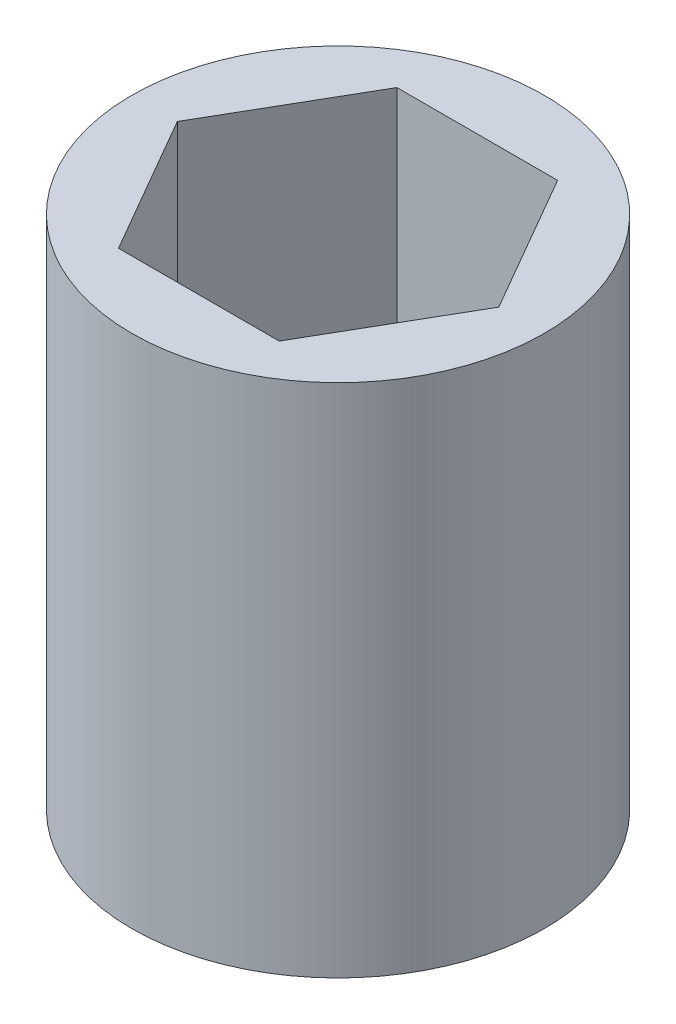
ISO-10303-21;
HEADER;
FILE_DESCRIPTION(('STEP AP214'),'2;1');
FILE_NAME('part.step','',(''),(''),'','','');
FILE_SCHEMA(('AUTOMOTIVE_DESIGN { 1 0 10303 214 1 1 1 1 }'));
ENDSEC;
DATA;
#1=APPLICATION_CONTEXT('core data for automotive mechanical design processes');
#2=APPLICATION_PROTOCOL_DEFINITION('international standard','automotive_design',2000,#1);
#3=PRODUCT_CONTEXT('',#1,'mechanical');
#4=PRODUCT('Part','Part','',(#3));
#5=PRODUCT_RELATED_PRODUCT_CATEGORY('part','',(#4));
#6=PRODUCT_DEFINITION_FORMATION('','',#4);
#7=PRODUCT_DEFINITION_CONTEXT('part definition',#1,'design');
#8=PRODUCT_DEFINITION('design','',#6,#7);
#9=PRODUCT_DEFINITION_SHAPE('','',#8);
#10=(LENGTH_UNIT() NAMED_UNIT(*) SI_UNIT(.MILLI.,.METRE.));
#11=(NAMED_UNIT(*) PLANE_ANGLE_UNIT() SI_UNIT($,.RADIAN.));
#12=(NAMED_UNIT(*) SI_UNIT($,.STERADIAN.) SOLID_ANGLE_UNIT());
#13=UNCERTAINTY_MEASURE_WITH_UNIT(LENGTH_MEASURE(1.E-05),#10,'distance_accuracy_value','');
#14=(GEOMETRIC_REPRESENTATION_CONTEXT(3) GLOBAL_UNCERTAINTY_ASSIGNED_CONTEXT((#13)) GLOBAL_UNIT_ASSIGNED_CONTEXT((#10,
#11,#12)) REPRESENTATION_CONTEXT('',''));
#15=CARTESIAN_POINT('',(0.,0.,0.));
#16=DIRECTION('',(0.,0.,1.));
#17=DIRECTION('',(1.,0.,0.));
#18=AXIS2_PLACEMENT_3D('',#15,#16,#17);
#19=CARTESIAN_POINT('',(0.,25.4,0.));
#20=DIRECTION('',(0.,1.,0.));
#21=DIRECTION('',(0.,0.,1.));
#22=AXIS2_PLACEMENT_3D('',#19,#20,#21);
#23=PLANE('',#22);
#24=CARTESIAN_POINT('',(0.,25.4,0.));
#25=DIRECTION('',(0.,1.,0.));
#26=DIRECTION('',(0.,0.,1.));
#27=AXIS2_PLACEMENT_3D('',#24,#25,#26);
#28=CIRCLE('',#27,10.16);
#29=CARTESIAN_POINT('',(0.,25.4,10.16));
#30=VERTEX_POINT('',#29);
#31=EDGE_CURVE('E11',#30,#30,#28,.T.);
#32=ORIENTED_EDGE('',*,*,#31,.T.);
#33=EDGE_LOOP('',(#32));
#34=FACE_BOUND('',#33,.T.);
#35=DIRECTION('',(-0.5,0.,-0.866025403784438));
#36=VECTOR('',#35,1.);
#37=CARTESIAN_POINT('',(7.9189362922049,25.4,0.));
#38=LINE('',#37,#36);
#39=CARTESIAN_POINT('',(7.9189362922049,25.4,0.));
#40=VERTEX_POINT('',#39);
#41=CARTESIAN_POINT('',(3.95946814610245,25.4,-6.858));
#42=VERTEX_POINT('',#41);
#43=EDGE_CURVE('E102',#40,#42,#38,.T.);
#44=ORIENTED_EDGE('',*,*,#43,.F.);
#45=DIRECTION('',(0.5,0.,-0.866025403784439));
#46=VECTOR('',#45,1.);
#47=CARTESIAN_POINT('',(3.95946814610245,25.4,6.858));
#48=LINE('',#47,#46);
#49=CARTESIAN_POINT('',(3.95946814610245,25.4,6.858));
#50=VERTEX_POINT('',#49);
#51=EDGE_CURVE('E93',#50,#40,#48,.T.);
#52=ORIENTED_EDGE('',*,*,#51,.F.);
#53=DIRECTION('',(1.,0.,0.));
#54=VECTOR('',#53,1.);
#55=CARTESIAN_POINT('',(-3.95946814610245,25.4,6.858));
#56=LINE('',#55,#54);
#57=CARTESIAN_POINT('',(-3.95946814610245,25.4,6.858));
#58=VERTEX_POINT('',#57);
#59=EDGE_CURVE('E127',#58,#50,#56,.T.);
#60=ORIENTED_EDGE('',*,*,#59,.F.);
#61=DIRECTION('',(0.5,0.,0.866025403784439));
#62=VECTOR('',#61,1.);
#63=CARTESIAN_POINT('',(-7.91893629220491,25.4,0.));
#64=LINE('',#63,#62);
#65=CARTESIAN_POINT('',(-7.91893629220491,25.4,0.));
#66=VERTEX_POINT('',#65);
#67=EDGE_CURVE('E124',#66,#58,#64,.T.);
#68=ORIENTED_EDGE('',*,*,#67,.F.);
#69=DIRECTION('',(-0.5,0.,0.866025403784439));
#70=VECTOR('',#69,1.);
#71=CARTESIAN_POINT('',(-3.95946814610245,25.4,-6.858));
#72=LINE('',#71,#70);
#73=CARTESIAN_POINT('',(-3.95946814610245,25.4,-6.858));
#74=VERTEX_POINT('',#73);
#75=EDGE_CURVE('E119',#74,#66,#72,.T.);
#76=ORIENTED_EDGE('',*,*,#75,.F.);
#77=DIRECTION('',(-1.,0.,0.));
#78=VECTOR('',#77,1.);
#79=CARTESIAN_POINT('',(3.95946814610245,25.4,-6.858));
#80=LINE('',#79,#78);
#81=EDGE_CURVE('E115',#42,#74,#80,.T.);
#82=ORIENTED_EDGE('',*,*,#81,.F.);
#83=EDGE_LOOP('',(#44,#52,#60,#68,#76,#82));
#84=FACE_BOUND('',#83,.T.);
#85=ADVANCED_FACE('F39',(#34,#84),#23,.T.);
#86=CARTESIAN_POINT('',(0.,0.,0.));
#87=DIRECTION('',(0.,1.,0.));
#88=DIRECTION('',(0.,0.,1.));
#89=AXIS2_PLACEMENT_3D('',#86,#87,#88);
#90=PLANE('',#89);
#91=CARTESIAN_POINT('',(0.,0.,0.));
#92=DIRECTION('',(0.,1.,0.));
#93=DIRECTION('',(0.,0.,1.));
#94=AXIS2_PLACEMENT_3D('',#91,#92,#93);
#95=CIRCLE('',#94,10.16);
#96=CARTESIAN_POINT('',(0.,0.,10.16));
#97=VERTEX_POINT('',#96);
#98=EDGE_CURVE('E43',#97,#97,#95,.T.);
#99=ORIENTED_EDGE('',*,*,#98,.F.);
#100=EDGE_LOOP('',(#99));
#101=FACE_BOUND('',#100,.T.);
#102=DIRECTION('',(0.5,0.,-0.866025403784439));
#103=VECTOR('',#102,1.);
#104=CARTESIAN_POINT('',(3.95946814610245,0.,6.858));
#105=LINE('',#104,#103);
#106=CARTESIAN_POINT('',(3.95946814610245,0.,6.858));
#107=VERTEX_POINT('',#106);
#108=CARTESIAN_POINT('',(7.9189362922049,0.,0.));
#109=VERTEX_POINT('',#108);
#110=EDGE_CURVE('E63',#107,#109,#105,.T.);
#111=ORIENTED_EDGE('',*,*,#110,.T.);
#112=DIRECTION('',(-0.5,0.,-0.866025403784438));
#113=VECTOR('',#112,1.);
#114=CARTESIAN_POINT('',(7.9189362922049,0.,0.));
#115=LINE('',#114,#113);
#116=CARTESIAN_POINT('',(3.95946814610245,0.,-6.858));
#117=VERTEX_POINT('',#116);
#118=EDGE_CURVE('E109',#109,#117,#115,.T.);
#119=ORIENTED_EDGE('',*,*,#118,.T.);
#120=DIRECTION('',(-1.,0.,0.));
#121=VECTOR('',#120,1.);
#122=CARTESIAN_POINT('',(3.95946814610245,0.,-6.858));
#123=LINE('',#122,#121);
#124=CARTESIAN_POINT('',(-3.95946814610245,0.,-6.858));
#125=VERTEX_POINT('',#124);
#126=EDGE_CURVE('E134',#117,#125,#123,.T.);
#127=ORIENTED_EDGE('',*,*,#126,.T.);
#128=DIRECTION('',(-0.5,0.,0.866025403784439));
#129=VECTOR('',#128,1.);
#130=CARTESIAN_POINT('',(-3.95946814610245,0.,-6.858));
#131=LINE('',#130,#129);
#132=CARTESIAN_POINT('',(-7.91893629220491,0.,0.));
#133=VERTEX_POINT('',#132);
#134=EDGE_CURVE('E138',#125,#133,#131,.T.);
#135=ORIENTED_EDGE('',*,*,#134,.T.);
#136=DIRECTION('',(0.5,0.,0.866025403784439));
#137=VECTOR('',#136,1.);
#138=CARTESIAN_POINT('',(-7.91893629220491,0.,0.));
#139=LINE('',#138,#137);
#140=CARTESIAN_POINT('',(-3.95946814610245,0.,6.858));
#141=VERTEX_POINT('',#140);
#142=EDGE_CURVE('E142',#133,#141,#139,.T.);
#143=ORIENTED_EDGE('',*,*,#142,.T.);
#144=DIRECTION('',(1.,0.,0.));
#145=VECTOR('',#144,1.);
#146=CARTESIAN_POINT('',(-3.95946814610245,0.,6.858));
#147=LINE('',#146,#145);
#148=EDGE_CURVE('E103',#141,#107,#147,.T.);
#149=ORIENTED_EDGE('',*,*,#148,.T.);
#150=EDGE_LOOP('',(#111,#119,#127,#135,#143,#149));
#151=FACE_BOUND('',#150,.T.);
#152=ADVANCED_FACE('F166',(#101,#151),#90,.F.);
#153=CARTESIAN_POINT('',(0.,25.4,0.));
#154=DIRECTION('',(0.,-1.,0.));
#155=DIRECTION('',(0.,0.,-1.));
#156=AXIS2_PLACEMENT_3D('',#153,#154,#155);
#157=CYLINDRICAL_SURFACE('',#156,10.16);
#158=ORIENTED_EDGE('',*,*,#31,.F.);
#159=EDGE_LOOP('',(#158));
#160=FACE_BOUND('',#159,.T.);
#161=ORIENTED_EDGE('',*,*,#98,.T.);
#162=EDGE_LOOP('',(#161));
#163=FACE_BOUND('',#162,.T.);
#164=ADVANCED_FACE('F41',(#160,#163),#157,.T.);
#165=CARTESIAN_POINT('',(3.95946814610245,25.4,6.858));
#166=DIRECTION('',(-0.866025403784439,0.,-0.5));
#167=DIRECTION('',(-0.5,0.,0.866025403784439));
#168=AXIS2_PLACEMENT_3D('',#165,#166,#167);
#169=PLANE('',#168);
#170=ORIENTED_EDGE('',*,*,#110,.F.);
#171=DIRECTION('',(0.,-1.,0.));
#172=VECTOR('',#171,1.);
#173=CARTESIAN_POINT('',(3.95946814610245,25.4,6.858));
#174=LINE('',#173,#172);
#175=EDGE_CURVE('E97',#50,#107,#174,.T.);
#176=ORIENTED_EDGE('',*,*,#175,.F.);
#177=ORIENTED_EDGE('',*,*,#51,.T.);
#178=DIRECTION('',(0.,-1.,0.));
#179=VECTOR('',#178,1.);
#180=CARTESIAN_POINT('',(7.9189362922049,25.4,0.));
#181=LINE('',#180,#179);
#182=EDGE_CURVE('E96',#40,#109,#181,.T.);
#183=ORIENTED_EDGE('',*,*,#182,.T.);
#184=EDGE_LOOP('',(#170,#176,#177,#183));
#185=FACE_BOUND('',#184,.T.);
#186=ADVANCED_FACE('F95',(#185),#169,.T.);
#187=CARTESIAN_POINT('',(7.9189362922049,25.4,0.));
#188=DIRECTION('',(-0.866025403784439,0.,0.5));
#189=DIRECTION('',(0.5,0.,0.866025403784439));
#190=AXIS2_PLACEMENT_3D('',#187,#188,#189);
#191=PLANE('',#190);
#192=ORIENTED_EDGE('',*,*,#118,.F.);
#193=ORIENTED_EDGE('',*,*,#182,.F.);
#194=ORIENTED_EDGE('',*,*,#43,.T.);
#195=DIRECTION('',(0.,-1.,0.));
#196=VECTOR('',#195,1.);
#197=CARTESIAN_POINT('',(3.95946814610245,25.4,-6.858));
#198=LINE('',#197,#196);
#199=EDGE_CURVE('E111',#42,#117,#198,.T.);
#200=ORIENTED_EDGE('',*,*,#199,.T.);
#201=EDGE_LOOP('',(#192,#193,#194,#200));
#202=FACE_BOUND('',#201,.T.);
#203=ADVANCED_FACE('F106',(#202),#191,.T.);
#204=CARTESIAN_POINT('',(3.95946814610245,25.4,-6.858));
#205=DIRECTION('',(0.,0.,1.));
#206=DIRECTION('',(1.,0.,0.));
#207=AXIS2_PLACEMENT_3D('',#204,#205,#206);
#208=PLANE('',#207);
#209=ORIENTED_EDGE('',*,*,#126,.F.);
#210=ORIENTED_EDGE('',*,*,#199,.F.);
#211=ORIENTED_EDGE('',*,*,#81,.T.);
#212=DIRECTION('',(0.,-1.,0.));
#213=VECTOR('',#212,1.);
#214=CARTESIAN_POINT('',(-3.95946814610245,25.4,-6.858));
#215=LINE('',#214,#213);
#216=EDGE_CURVE('E156',#74,#125,#215,.T.);
#217=ORIENTED_EDGE('',*,*,#216,.T.);
#218=EDGE_LOOP('',(#209,#210,#211,#217));
#219=FACE_BOUND('',#218,.T.);
#220=ADVANCED_FACE('F162',(#219),#208,.T.);
#221=CARTESIAN_POINT('',(-3.95946814610245,25.4,-6.858));
#222=DIRECTION('',(0.866025403784439,0.,0.5));
#223=DIRECTION('',(0.5,0.,-0.866025403784439));
#224=AXIS2_PLACEMENT_3D('',#221,#222,#223);
#225=PLANE('',#224);
#226=ORIENTED_EDGE('',*,*,#134,.F.);
#227=ORIENTED_EDGE('',*,*,#216,.F.);
#228=ORIENTED_EDGE('',*,*,#75,.T.);
#229=DIRECTION('',(0.,-1.,0.));
#230=VECTOR('',#229,1.);
#231=CARTESIAN_POINT('',(-7.91893629220491,25.4,0.));
#232=LINE('',#231,#230);
#233=EDGE_CURVE('E153',#66,#133,#232,.T.);
#234=ORIENTED_EDGE('',*,*,#233,.T.);
#235=EDGE_LOOP('',(#226,#227,#228,#234));
#236=FACE_BOUND('',#235,.T.);
#237=ADVANCED_FACE('F174',(#236),#225,.T.);
#238=CARTESIAN_POINT('',(-7.91893629220491,25.4,0.));
#239=DIRECTION('',(0.866025403784438,0.,-0.5));
#240=DIRECTION('',(-0.5,0.,-0.866025403784439));
#241=AXIS2_PLACEMENT_3D('',#238,#239,#240);
#242=PLANE('',#241);
#243=ORIENTED_EDGE('',*,*,#142,.F.);
#244=ORIENTED_EDGE('',*,*,#233,.F.);
#245=ORIENTED_EDGE('',*,*,#67,.T.);
#246=DIRECTION('',(0.,-1.,0.));
#247=VECTOR('',#246,1.);
#248=CARTESIAN_POINT('',(-3.95946814610245,25.4,6.858));
#249=LINE('',#248,#247);
#250=EDGE_CURVE('E55',#58,#141,#249,.T.);
#251=ORIENTED_EDGE('',*,*,#250,.T.);
#252=EDGE_LOOP('',(#243,#244,#245,#251));
#253=FACE_BOUND('',#252,.T.);
#254=ADVANCED_FACE('F172',(#253),#242,.T.);
#255=CARTESIAN_POINT('',(-3.95946814610245,25.4,6.858));
#256=DIRECTION('',(0.,0.,-1.));
#257=DIRECTION('',(-1.,0.,0.));
#258=AXIS2_PLACEMENT_3D('',#255,#256,#257);
#259=PLANE('',#258);
#260=ORIENTED_EDGE('',*,*,#148,.F.);
#261=ORIENTED_EDGE('',*,*,#250,.F.);
#262=ORIENTED_EDGE('',*,*,#59,.T.);
#263=ORIENTED_EDGE('',*,*,#175,.T.);
#264=EDGE_LOOP('',(#260,#261,#262,#263));
#265=FACE_BOUND('',#264,.T.);
#266=ADVANCED_FACE('F168',(#265),#259,.T.);
#267=CLOSED_SHELL('',(#85,#152,#164,#186,#203,#220,#237,#254,#266));
#268=MANIFOLD_SOLID_BREP('B2',#267);
#269=ADVANCED_BREP_SHAPE_REPRESENTATION('',(#18,#268),#14);
#270=SHAPE_DEFINITION_REPRESENTATION(#9,#269);
ENDSEC;
END-ISO-10303-21;
